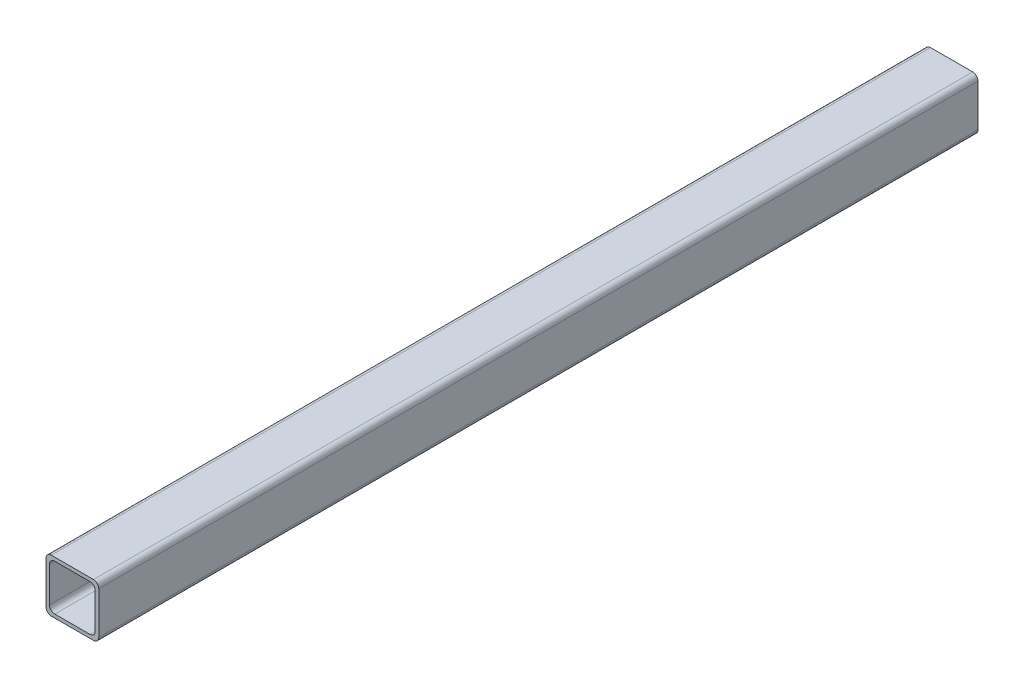
ISO-10303-21;
HEADER;
FILE_DESCRIPTION(('STEP AP214'),'2;1');
FILE_NAME('part.step','',(''),(''),'','','');
FILE_SCHEMA(('AUTOMOTIVE_DESIGN { 1 0 10303 214 1 1 1 1 }'));
ENDSEC;
DATA;
#1=APPLICATION_CONTEXT('core data for automotive mechanical design processes');
#2=APPLICATION_PROTOCOL_DEFINITION('international standard','automotive_design',2000,#1);
#3=PRODUCT_CONTEXT('',#1,'mechanical');
#4=PRODUCT('Part','Part','',(#3));
#5=PRODUCT_RELATED_PRODUCT_CATEGORY('part','',(#4));
#6=PRODUCT_DEFINITION_FORMATION('','',#4);
#7=PRODUCT_DEFINITION_CONTEXT('part definition',#1,'design');
#8=PRODUCT_DEFINITION('design','',#6,#7);
#9=PRODUCT_DEFINITION_SHAPE('','',#8);
#10=(LENGTH_UNIT() NAMED_UNIT(*) SI_UNIT(.MILLI.,.METRE.));
#11=(NAMED_UNIT(*) PLANE_ANGLE_UNIT() SI_UNIT($,.RADIAN.));
#12=(NAMED_UNIT(*) SI_UNIT($,.STERADIAN.) SOLID_ANGLE_UNIT());
#13=UNCERTAINTY_MEASURE_WITH_UNIT(LENGTH_MEASURE(1.E-05),#10,'distance_accuracy_value','');
#14=(GEOMETRIC_REPRESENTATION_CONTEXT(3) GLOBAL_UNCERTAINTY_ASSIGNED_CONTEXT((#13)) GLOBAL_UNIT_ASSIGNED_CONTEXT((#10,
#11,#12)) REPRESENTATION_CONTEXT('',''));
#15=CARTESIAN_POINT('',(0.,0.,0.));
#16=DIRECTION('',(0.,0.,1.));
#17=DIRECTION('',(1.,0.,0.));
#18=AXIS2_PLACEMENT_3D('',#15,#16,#17);
#19=CARTESIAN_POINT('',(12.,-12.,-500.));
#20=DIRECTION('',(0.,0.,1.));
#21=DIRECTION('',(1.,0.,0.));
#22=AXIS2_PLACEMENT_3D('',#19,#20,#21);
#23=CYLINDRICAL_SURFACE('',#22,3.);
#24=CARTESIAN_POINT('',(12.,-12.,0.));
#25=DIRECTION('',(0.,0.,1.));
#26=DIRECTION('',(1.,0.,0.));
#27=AXIS2_PLACEMENT_3D('',#24,#25,#26);
#28=CIRCLE('',#27,3.);
#29=CARTESIAN_POINT('',(12.,-15.,0.));
#30=VERTEX_POINT('',#29);
#31=CARTESIAN_POINT('',(15.,-12.,0.));
#32=VERTEX_POINT('',#31);
#33=EDGE_CURVE('E203',#30,#32,#28,.T.);
#34=ORIENTED_EDGE('',*,*,#33,.F.);
#35=DIRECTION('',(0.,0.,1.));
#36=VECTOR('',#35,1.);
#37=CARTESIAN_POINT('',(12.,-15.,-500.));
#38=LINE('',#37,#36);
#39=CARTESIAN_POINT('',(12.,-15.,-500.));
#40=VERTEX_POINT('',#39);
#41=EDGE_CURVE('E11',#40,#30,#38,.T.);
#42=ORIENTED_EDGE('',*,*,#41,.F.);
#43=CARTESIAN_POINT('',(12.,-12.,-500.));
#44=DIRECTION('',(0.,0.,1.));
#45=DIRECTION('',(1.,0.,0.));
#46=AXIS2_PLACEMENT_3D('',#43,#44,#45);
#47=CIRCLE('',#46,3.);
#48=CARTESIAN_POINT('',(15.,-12.,-500.));
#49=VERTEX_POINT('',#48);
#50=EDGE_CURVE('E215',#40,#49,#47,.T.);
#51=ORIENTED_EDGE('',*,*,#50,.T.);
#52=DIRECTION('',(0.,0.,1.));
#53=VECTOR('',#52,1.);
#54=CARTESIAN_POINT('',(15.,-12.,-500.));
#55=LINE('',#54,#53);
#56=EDGE_CURVE('E36',#49,#32,#55,.T.);
#57=ORIENTED_EDGE('',*,*,#56,.T.);
#58=EDGE_LOOP('',(#34,#42,#51,#57));
#59=FACE_BOUND('',#58,.T.);
#60=ADVANCED_FACE('F33',(#59),#23,.T.);
#61=CARTESIAN_POINT('',(-12.,-15.,-500.));
#62=DIRECTION('',(0.,-1.,0.));
#63=DIRECTION('',(1.,0.,0.));
#64=AXIS2_PLACEMENT_3D('',#61,#62,#63);
#65=PLANE('',#64);
#66=DIRECTION('',(1.,0.,0.));
#67=VECTOR('',#66,1.);
#68=CARTESIAN_POINT('',(-12.,-15.,0.));
#69=LINE('',#68,#67);
#70=CARTESIAN_POINT('',(-12.,-15.,0.));
#71=VERTEX_POINT('',#70);
#72=EDGE_CURVE('E219',#71,#30,#69,.T.);
#73=ORIENTED_EDGE('',*,*,#72,.F.);
#74=DIRECTION('',(0.,0.,1.));
#75=VECTOR('',#74,1.);
#76=CARTESIAN_POINT('',(-12.,-15.,-500.));
#77=LINE('',#76,#75);
#78=CARTESIAN_POINT('',(-12.,-15.,-500.));
#79=VERTEX_POINT('',#78);
#80=EDGE_CURVE('E41',#79,#71,#77,.T.);
#81=ORIENTED_EDGE('',*,*,#80,.F.);
#82=DIRECTION('',(1.,0.,0.));
#83=VECTOR('',#82,1.);
#84=CARTESIAN_POINT('',(-12.,-15.,-500.));
#85=LINE('',#84,#83);
#86=EDGE_CURVE('E237',#79,#40,#85,.T.);
#87=ORIENTED_EDGE('',*,*,#86,.T.);
#88=ORIENTED_EDGE('',*,*,#41,.T.);
#89=EDGE_LOOP('',(#73,#81,#87,#88));
#90=FACE_BOUND('',#89,.T.);
#91=ADVANCED_FACE('F284',(#90),#65,.T.);
#92=CARTESIAN_POINT('',(-12.,-12.,-500.));
#93=DIRECTION('',(0.,0.,1.));
#94=DIRECTION('',(1.,0.,0.));
#95=AXIS2_PLACEMENT_3D('',#92,#93,#94);
#96=CYLINDRICAL_SURFACE('',#95,3.);
#97=CARTESIAN_POINT('',(-12.,-12.,0.));
#98=DIRECTION('',(0.,0.,1.));
#99=DIRECTION('',(-1.,0.,0.));
#100=AXIS2_PLACEMENT_3D('',#97,#98,#99);
#101=CIRCLE('',#100,3.);
#102=CARTESIAN_POINT('',(-15.,-12.,0.));
#103=VERTEX_POINT('',#102);
#104=EDGE_CURVE('E257',#103,#71,#101,.T.);
#105=ORIENTED_EDGE('',*,*,#104,.F.);
#106=DIRECTION('',(0.,0.,1.));
#107=VECTOR('',#106,1.);
#108=CARTESIAN_POINT('',(-15.,-12.,-500.));
#109=LINE('',#108,#107);
#110=CARTESIAN_POINT('',(-15.,-12.,-500.));
#111=VERTEX_POINT('',#110);
#112=EDGE_CURVE('E263',#111,#103,#109,.T.);
#113=ORIENTED_EDGE('',*,*,#112,.F.);
#114=CARTESIAN_POINT('',(-12.,-12.,-500.));
#115=DIRECTION('',(0.,0.,1.));
#116=DIRECTION('',(-1.,0.,0.));
#117=AXIS2_PLACEMENT_3D('',#114,#115,#116);
#118=CIRCLE('',#117,3.);
#119=EDGE_CURVE('E234',#111,#79,#118,.T.);
#120=ORIENTED_EDGE('',*,*,#119,.T.);
#121=ORIENTED_EDGE('',*,*,#80,.T.);
#122=EDGE_LOOP('',(#105,#113,#120,#121));
#123=FACE_BOUND('',#122,.T.);
#124=ADVANCED_FACE('F303',(#123),#96,.T.);
#125=CARTESIAN_POINT('',(-15.,-12.,-500.));
#126=DIRECTION('',(-1.,0.,0.));
#127=DIRECTION('',(0.,-1.,0.));
#128=AXIS2_PLACEMENT_3D('',#125,#126,#127);
#129=PLANE('',#128);
#130=DIRECTION('',(0.,-1.,0.));
#131=VECTOR('',#130,1.);
#132=CARTESIAN_POINT('',(-15.,-12.,0.));
#133=LINE('',#132,#131);
#134=CARTESIAN_POINT('',(-15.,12.,0.));
#135=VERTEX_POINT('',#134);
#136=EDGE_CURVE('E254',#135,#103,#133,.T.);
#137=ORIENTED_EDGE('',*,*,#136,.F.);
#138=DIRECTION('',(0.,0.,1.));
#139=VECTOR('',#138,1.);
#140=CARTESIAN_POINT('',(-15.,12.,-500.));
#141=LINE('',#140,#139);
#142=CARTESIAN_POINT('',(-15.,12.,-500.));
#143=VERTEX_POINT('',#142);
#144=EDGE_CURVE('E265',#143,#135,#141,.T.);
#145=ORIENTED_EDGE('',*,*,#144,.F.);
#146=DIRECTION('',(0.,-1.,0.));
#147=VECTOR('',#146,1.);
#148=CARTESIAN_POINT('',(-15.,-12.,-500.));
#149=LINE('',#148,#147);
#150=EDGE_CURVE('E231',#143,#111,#149,.T.);
#151=ORIENTED_EDGE('',*,*,#150,.T.);
#152=ORIENTED_EDGE('',*,*,#112,.T.);
#153=EDGE_LOOP('',(#137,#145,#151,#152));
#154=FACE_BOUND('',#153,.T.);
#155=ADVANCED_FACE('F301',(#154),#129,.T.);
#156=CARTESIAN_POINT('',(-12.,12.,-500.));
#157=DIRECTION('',(0.,0.,1.));
#158=DIRECTION('',(1.,0.,0.));
#159=AXIS2_PLACEMENT_3D('',#156,#157,#158);
#160=CYLINDRICAL_SURFACE('',#159,3.);
#161=CARTESIAN_POINT('',(-12.,12.,0.));
#162=DIRECTION('',(0.,0.,1.));
#163=DIRECTION('',(-1.,0.,0.));
#164=AXIS2_PLACEMENT_3D('',#161,#162,#163);
#165=CIRCLE('',#164,3.);
#166=CARTESIAN_POINT('',(-12.,15.,0.));
#167=VERTEX_POINT('',#166);
#168=EDGE_CURVE('E251',#167,#135,#165,.T.);
#169=ORIENTED_EDGE('',*,*,#168,.F.);
#170=DIRECTION('',(0.,0.,1.));
#171=VECTOR('',#170,1.);
#172=CARTESIAN_POINT('',(-12.,15.,-500.));
#173=LINE('',#172,#171);
#174=CARTESIAN_POINT('',(-12.,15.,-500.));
#175=VERTEX_POINT('',#174);
#176=EDGE_CURVE('E267',#175,#167,#173,.T.);
#177=ORIENTED_EDGE('',*,*,#176,.F.);
#178=CARTESIAN_POINT('',(-12.,12.,-500.));
#179=DIRECTION('',(0.,0.,1.));
#180=DIRECTION('',(-1.,0.,0.));
#181=AXIS2_PLACEMENT_3D('',#178,#179,#180);
#182=CIRCLE('',#181,3.);
#183=EDGE_CURVE('E228',#175,#143,#182,.T.);
#184=ORIENTED_EDGE('',*,*,#183,.T.);
#185=ORIENTED_EDGE('',*,*,#144,.T.);
#186=EDGE_LOOP('',(#169,#177,#184,#185));
#187=FACE_BOUND('',#186,.T.);
#188=ADVANCED_FACE('F297',(#187),#160,.T.);
#189=CARTESIAN_POINT('',(-12.,15.,-500.));
#190=DIRECTION('',(0.,1.,0.));
#191=DIRECTION('',(-1.,0.,0.));
#192=AXIS2_PLACEMENT_3D('',#189,#190,#191);
#193=PLANE('',#192);
#194=DIRECTION('',(-1.,0.,0.));
#195=VECTOR('',#194,1.);
#196=CARTESIAN_POINT('',(-12.,15.,0.));
#197=LINE('',#196,#195);
#198=CARTESIAN_POINT('',(12.,15.,0.));
#199=VERTEX_POINT('',#198);
#200=EDGE_CURVE('E248',#199,#167,#197,.T.);
#201=ORIENTED_EDGE('',*,*,#200,.F.);
#202=DIRECTION('',(0.,0.,1.));
#203=VECTOR('',#202,1.);
#204=CARTESIAN_POINT('',(12.,15.,-500.));
#205=LINE('',#204,#203);
#206=CARTESIAN_POINT('',(12.,15.,-500.));
#207=VERTEX_POINT('',#206);
#208=EDGE_CURVE('E269',#207,#199,#205,.T.);
#209=ORIENTED_EDGE('',*,*,#208,.F.);
#210=DIRECTION('',(-1.,0.,0.));
#211=VECTOR('',#210,1.);
#212=CARTESIAN_POINT('',(-12.,15.,-500.));
#213=LINE('',#212,#211);
#214=EDGE_CURVE('E225',#207,#175,#213,.T.);
#215=ORIENTED_EDGE('',*,*,#214,.T.);
#216=ORIENTED_EDGE('',*,*,#176,.T.);
#217=EDGE_LOOP('',(#201,#209,#215,#216));
#218=FACE_BOUND('',#217,.T.);
#219=ADVANCED_FACE('F295',(#218),#193,.T.);
#220=CARTESIAN_POINT('',(12.,12.,-500.));
#221=DIRECTION('',(0.,0.,1.));
#222=DIRECTION('',(1.,0.,0.));
#223=AXIS2_PLACEMENT_3D('',#220,#221,#222);
#224=CYLINDRICAL_SURFACE('',#223,3.);
#225=CARTESIAN_POINT('',(12.,12.,0.));
#226=DIRECTION('',(0.,0.,1.));
#227=DIRECTION('',(-1.,0.,0.));
#228=AXIS2_PLACEMENT_3D('',#225,#226,#227);
#229=CIRCLE('',#228,3.);
#230=CARTESIAN_POINT('',(15.,12.,0.));
#231=VERTEX_POINT('',#230);
#232=EDGE_CURVE('E245',#231,#199,#229,.T.);
#233=ORIENTED_EDGE('',*,*,#232,.F.);
#234=DIRECTION('',(0.,0.,1.));
#235=VECTOR('',#234,1.);
#236=CARTESIAN_POINT('',(15.,12.,-500.));
#237=LINE('',#236,#235);
#238=CARTESIAN_POINT('',(15.,12.,-500.));
#239=VERTEX_POINT('',#238);
#240=EDGE_CURVE('E270',#239,#231,#237,.T.);
#241=ORIENTED_EDGE('',*,*,#240,.F.);
#242=CARTESIAN_POINT('',(12.,12.,-500.));
#243=DIRECTION('',(0.,0.,1.));
#244=DIRECTION('',(-1.,0.,0.));
#245=AXIS2_PLACEMENT_3D('',#242,#243,#244);
#246=CIRCLE('',#245,3.);
#247=EDGE_CURVE('E222',#239,#207,#246,.T.);
#248=ORIENTED_EDGE('',*,*,#247,.T.);
#249=ORIENTED_EDGE('',*,*,#208,.T.);
#250=EDGE_LOOP('',(#233,#241,#248,#249));
#251=FACE_BOUND('',#250,.T.);
#252=ADVANCED_FACE('F291',(#251),#224,.T.);
#253=CARTESIAN_POINT('',(15.,-12.,-500.));
#254=DIRECTION('',(1.,0.,0.));
#255=DIRECTION('',(0.,0.,-1.));
#256=AXIS2_PLACEMENT_3D('',#253,#254,#255);
#257=PLANE('',#256);
#258=DIRECTION('',(0.,1.,0.));
#259=VECTOR('',#258,1.);
#260=CARTESIAN_POINT('',(15.,-12.,0.));
#261=LINE('',#260,#259);
#262=EDGE_CURVE('E242',#32,#231,#261,.T.);
#263=ORIENTED_EDGE('',*,*,#262,.F.);
#264=ORIENTED_EDGE('',*,*,#56,.F.);
#265=DIRECTION('',(0.,1.,0.));
#266=VECTOR('',#265,1.);
#267=CARTESIAN_POINT('',(15.,-12.,-500.));
#268=LINE('',#267,#266);
#269=EDGE_CURVE('E218',#49,#239,#268,.T.);
#270=ORIENTED_EDGE('',*,*,#269,.T.);
#271=ORIENTED_EDGE('',*,*,#240,.T.);
#272=EDGE_LOOP('',(#263,#264,#270,#271));
#273=FACE_BOUND('',#272,.T.);
#274=ADVANCED_FACE('F278',(#273),#257,.T.);
#275=CARTESIAN_POINT('',(12.,-12.,-500.));
#276=DIRECTION('',(0.,0.,1.));
#277=DIRECTION('',(1.,0.,0.));
#278=AXIS2_PLACEMENT_3D('',#275,#276,#277);
#279=PLANE('',#278);
#280=DIRECTION('',(1.,0.,0.));
#281=VECTOR('',#280,1.);
#282=CARTESIAN_POINT('',(-9.99999999999998,-13.,-500.));
#283=LINE('',#282,#281);
#284=CARTESIAN_POINT('',(-9.99999999999998,-13.,-500.));
#285=VERTEX_POINT('',#284);
#286=CARTESIAN_POINT('',(9.99999999999998,-13.,-500.));
#287=VERTEX_POINT('',#286);
#288=EDGE_CURVE('E154',#285,#287,#283,.T.);
#289=ORIENTED_EDGE('',*,*,#288,.T.);
#290=CARTESIAN_POINT('',(10.,-10.,-500.));
#291=DIRECTION('',(0.,0.,1.));
#292=DIRECTION('',(1.,0.,0.));
#293=AXIS2_PLACEMENT_3D('',#290,#291,#292);
#294=CIRCLE('',#293,3.);
#295=CARTESIAN_POINT('',(13.,-9.99999999999998,-500.));
#296=VERTEX_POINT('',#295);
#297=EDGE_CURVE('E148',#287,#296,#294,.T.);
#298=ORIENTED_EDGE('',*,*,#297,.T.);
#299=DIRECTION('',(0.,1.,0.));
#300=VECTOR('',#299,1.);
#301=CARTESIAN_POINT('',(13.,-9.99999999999998,-500.));
#302=LINE('',#301,#300);
#303=CARTESIAN_POINT('',(13.,9.99999999999997,-500.));
#304=VERTEX_POINT('',#303);
#305=EDGE_CURVE('E157',#296,#304,#302,.T.);
#306=ORIENTED_EDGE('',*,*,#305,.T.);
#307=CARTESIAN_POINT('',(10.,10.,-500.));
#308=DIRECTION('',(0.,0.,1.));
#309=DIRECTION('',(-1.,0.,0.));
#310=AXIS2_PLACEMENT_3D('',#307,#308,#309);
#311=CIRCLE('',#310,3.);
#312=CARTESIAN_POINT('',(9.99999999999998,13.,-500.));
#313=VERTEX_POINT('',#312);
#314=EDGE_CURVE('E49',#304,#313,#311,.T.);
#315=ORIENTED_EDGE('',*,*,#314,.T.);
#316=DIRECTION('',(-1.,0.,0.));
#317=VECTOR('',#316,1.);
#318=CARTESIAN_POINT('',(-9.99999999999998,13.,-500.));
#319=LINE('',#318,#317);
#320=CARTESIAN_POINT('',(-9.99999999999998,13.,-500.));
#321=VERTEX_POINT('',#320);
#322=EDGE_CURVE('E172',#313,#321,#319,.T.);
#323=ORIENTED_EDGE('',*,*,#322,.T.);
#324=CARTESIAN_POINT('',(-10.,10.,-500.));
#325=DIRECTION('',(0.,0.,1.));
#326=DIRECTION('',(-1.,0.,0.));
#327=AXIS2_PLACEMENT_3D('',#324,#325,#326);
#328=CIRCLE('',#327,3.);
#329=CARTESIAN_POINT('',(-13.,9.99999999999998,-500.));
#330=VERTEX_POINT('',#329);
#331=EDGE_CURVE('E175',#321,#330,#328,.T.);
#332=ORIENTED_EDGE('',*,*,#331,.T.);
#333=DIRECTION('',(0.,-1.,0.));
#334=VECTOR('',#333,1.);
#335=CARTESIAN_POINT('',(-13.,-9.99999999999998,-500.));
#336=LINE('',#335,#334);
#337=CARTESIAN_POINT('',(-13.,-10.,-500.));
#338=VERTEX_POINT('',#337);
#339=EDGE_CURVE('E178',#330,#338,#336,.T.);
#340=ORIENTED_EDGE('',*,*,#339,.T.);
#341=CARTESIAN_POINT('',(-10.,-10.,-500.));
#342=DIRECTION('',(0.,0.,1.));
#343=DIRECTION('',(-1.,0.,0.));
#344=AXIS2_PLACEMENT_3D('',#341,#342,#343);
#345=CIRCLE('',#344,3.);
#346=EDGE_CURVE('E181',#338,#285,#345,.T.);
#347=ORIENTED_EDGE('',*,*,#346,.T.);
#348=EDGE_LOOP('',(#289,#298,#306,#315,#323,#332,#340,#347));
#349=FACE_BOUND('',#348,.T.);
#350=ORIENTED_EDGE('',*,*,#50,.F.);
#351=ORIENTED_EDGE('',*,*,#86,.F.);
#352=ORIENTED_EDGE('',*,*,#119,.F.);
#353=ORIENTED_EDGE('',*,*,#150,.F.);
#354=ORIENTED_EDGE('',*,*,#183,.F.);
#355=ORIENTED_EDGE('',*,*,#214,.F.);
#356=ORIENTED_EDGE('',*,*,#247,.F.);
#357=ORIENTED_EDGE('',*,*,#269,.F.);
#358=EDGE_LOOP('',(#350,#351,#352,#353,#354,#355,#356,#357));
#359=FACE_BOUND('',#358,.T.);
#360=ADVANCED_FACE('F161',(#349,#359),#279,.F.);
#361=CARTESIAN_POINT('',(12.,-12.,0.));
#362=DIRECTION('',(0.,0.,1.));
#363=DIRECTION('',(1.,0.,0.));
#364=AXIS2_PLACEMENT_3D('',#361,#362,#363);
#365=PLANE('',#364);
#366=CARTESIAN_POINT('',(10.,-10.,0.));
#367=DIRECTION('',(0.,0.,1.));
#368=DIRECTION('',(1.,0.,0.));
#369=AXIS2_PLACEMENT_3D('',#366,#367,#368);
#370=CIRCLE('',#369,3.);
#371=CARTESIAN_POINT('',(9.99999999999998,-13.,0.));
#372=VERTEX_POINT('',#371);
#373=CARTESIAN_POINT('',(13.,-9.99999999999998,0.));
#374=VERTEX_POINT('',#373);
#375=EDGE_CURVE('E57',#372,#374,#370,.T.);
#376=ORIENTED_EDGE('',*,*,#375,.F.);
#377=DIRECTION('',(1.,0.,0.));
#378=VECTOR('',#377,1.);
#379=CARTESIAN_POINT('',(-9.99999999999998,-13.,0.));
#380=LINE('',#379,#378);
#381=CARTESIAN_POINT('',(-9.99999999999998,-13.,0.));
#382=VERTEX_POINT('',#381);
#383=EDGE_CURVE('E165',#382,#372,#380,.T.);
#384=ORIENTED_EDGE('',*,*,#383,.F.);
#385=CARTESIAN_POINT('',(-10.,-10.,0.));
#386=DIRECTION('',(0.,0.,1.));
#387=DIRECTION('',(-1.,0.,0.));
#388=AXIS2_PLACEMENT_3D('',#385,#386,#387);
#389=CIRCLE('',#388,3.);
#390=CARTESIAN_POINT('',(-13.,-10.,0.));
#391=VERTEX_POINT('',#390);
#392=EDGE_CURVE('E168',#391,#382,#389,.T.);
#393=ORIENTED_EDGE('',*,*,#392,.F.);
#394=DIRECTION('',(0.,-1.,0.));
#395=VECTOR('',#394,1.);
#396=CARTESIAN_POINT('',(-13.,-9.99999999999998,0.));
#397=LINE('',#396,#395);
#398=CARTESIAN_POINT('',(-13.,9.99999999999998,0.));
#399=VERTEX_POINT('',#398);
#400=EDGE_CURVE('E196',#399,#391,#397,.T.);
#401=ORIENTED_EDGE('',*,*,#400,.F.);
#402=CARTESIAN_POINT('',(-10.,10.,0.));
#403=DIRECTION('',(0.,0.,1.));
#404=DIRECTION('',(-1.,0.,0.));
#405=AXIS2_PLACEMENT_3D('',#402,#403,#404);
#406=CIRCLE('',#405,3.);
#407=CARTESIAN_POINT('',(-9.99999999999998,13.,0.));
#408=VERTEX_POINT('',#407);
#409=EDGE_CURVE('E193',#408,#399,#406,.T.);
#410=ORIENTED_EDGE('',*,*,#409,.F.);
#411=DIRECTION('',(-1.,0.,0.));
#412=VECTOR('',#411,1.);
#413=CARTESIAN_POINT('',(-9.99999999999998,13.,0.));
#414=LINE('',#413,#412);
#415=CARTESIAN_POINT('',(9.99999999999998,13.,0.));
#416=VERTEX_POINT('',#415);
#417=EDGE_CURVE('E190',#416,#408,#414,.T.);
#418=ORIENTED_EDGE('',*,*,#417,.F.);
#419=CARTESIAN_POINT('',(10.,10.,0.));
#420=DIRECTION('',(0.,0.,1.));
#421=DIRECTION('',(-1.,0.,0.));
#422=AXIS2_PLACEMENT_3D('',#419,#420,#421);
#423=CIRCLE('',#422,3.);
#424=CARTESIAN_POINT('',(13.,9.99999999999998,0.));
#425=VERTEX_POINT('',#424);
#426=EDGE_CURVE('E187',#425,#416,#423,.T.);
#427=ORIENTED_EDGE('',*,*,#426,.F.);
#428=DIRECTION('',(0.,1.,0.));
#429=VECTOR('',#428,1.);
#430=CARTESIAN_POINT('',(13.,-9.99999999999998,0.));
#431=LINE('',#430,#429);
#432=EDGE_CURVE('E185',#374,#425,#431,.T.);
#433=ORIENTED_EDGE('',*,*,#432,.F.);
#434=EDGE_LOOP('',(#376,#384,#393,#401,#410,#418,#427,#433));
#435=FACE_BOUND('',#434,.T.);
#436=ORIENTED_EDGE('',*,*,#33,.T.);
#437=ORIENTED_EDGE('',*,*,#262,.T.);
#438=ORIENTED_EDGE('',*,*,#232,.T.);
#439=ORIENTED_EDGE('',*,*,#200,.T.);
#440=ORIENTED_EDGE('',*,*,#168,.T.);
#441=ORIENTED_EDGE('',*,*,#136,.T.);
#442=ORIENTED_EDGE('',*,*,#104,.T.);
#443=ORIENTED_EDGE('',*,*,#72,.T.);
#444=EDGE_LOOP('',(#436,#437,#438,#439,#440,#441,#442,#443));
#445=FACE_BOUND('',#444,.T.);
#446=ADVANCED_FACE('F280',(#435,#445),#365,.T.);
#447=CARTESIAN_POINT('',(10.,-10.,-500.));
#448=DIRECTION('',(0.,0.,1.));
#449=DIRECTION('',(1.,0.,0.));
#450=AXIS2_PLACEMENT_3D('',#447,#448,#449);
#451=CYLINDRICAL_SURFACE('',#450,3.);
#452=ORIENTED_EDGE('',*,*,#375,.T.);
#453=DIRECTION('',(0.,0.,1.));
#454=VECTOR('',#453,1.);
#455=CARTESIAN_POINT('',(13.,-9.99999999999998,-500.));
#456=LINE('',#455,#454);
#457=EDGE_CURVE('E144',#296,#374,#456,.T.);
#458=ORIENTED_EDGE('',*,*,#457,.F.);
#459=ORIENTED_EDGE('',*,*,#297,.F.);
#460=DIRECTION('',(0.,0.,1.));
#461=VECTOR('',#460,1.);
#462=CARTESIAN_POINT('',(9.99999999999998,-13.,-500.));
#463=LINE('',#462,#461);
#464=EDGE_CURVE('E201',#287,#372,#463,.T.);
#465=ORIENTED_EDGE('',*,*,#464,.T.);
#466=EDGE_LOOP('',(#452,#458,#459,#465));
#467=FACE_BOUND('',#466,.T.);
#468=ADVANCED_FACE('F146',(#467),#451,.F.);
#469=CARTESIAN_POINT('',(-9.99999999999998,-13.,-500.));
#470=DIRECTION('',(0.,-1.,0.));
#471=DIRECTION('',(0.,0.,-1.));
#472=AXIS2_PLACEMENT_3D('',#469,#470,#471);
#473=PLANE('',#472);
#474=ORIENTED_EDGE('',*,*,#383,.T.);
#475=ORIENTED_EDGE('',*,*,#464,.F.);
#476=ORIENTED_EDGE('',*,*,#288,.F.);
#477=DIRECTION('',(0.,0.,1.));
#478=VECTOR('',#477,1.);
#479=CARTESIAN_POINT('',(-9.99999999999998,-13.,-500.));
#480=LINE('',#479,#478);
#481=EDGE_CURVE('E204',#285,#382,#480,.T.);
#482=ORIENTED_EDGE('',*,*,#481,.T.);
#483=EDGE_LOOP('',(#474,#475,#476,#482));
#484=FACE_BOUND('',#483,.T.);
#485=ADVANCED_FACE('F386',(#484),#473,.F.);
#486=CARTESIAN_POINT('',(-10.,-10.,-500.));
#487=DIRECTION('',(0.,0.,1.));
#488=DIRECTION('',(1.,0.,0.));
#489=AXIS2_PLACEMENT_3D('',#486,#487,#488);
#490=CYLINDRICAL_SURFACE('',#489,3.);
#491=ORIENTED_EDGE('',*,*,#392,.T.);
#492=ORIENTED_EDGE('',*,*,#481,.F.);
#493=ORIENTED_EDGE('',*,*,#346,.F.);
#494=DIRECTION('',(0.,0.,1.));
#495=VECTOR('',#494,1.);
#496=CARTESIAN_POINT('',(-13.,-10.,-500.));
#497=LINE('',#496,#495);
#498=EDGE_CURVE('E206',#338,#391,#497,.T.);
#499=ORIENTED_EDGE('',*,*,#498,.T.);
#500=EDGE_LOOP('',(#491,#492,#493,#499));
#501=FACE_BOUND('',#500,.T.);
#502=ADVANCED_FACE('F395',(#501),#490,.F.);
#503=CARTESIAN_POINT('',(-13.,-9.99999999999998,-500.));
#504=DIRECTION('',(-1.,0.,0.));
#505=DIRECTION('',(0.,0.,1.));
#506=AXIS2_PLACEMENT_3D('',#503,#504,#505);
#507=PLANE('',#506);
#508=ORIENTED_EDGE('',*,*,#400,.T.);
#509=ORIENTED_EDGE('',*,*,#498,.F.);
#510=ORIENTED_EDGE('',*,*,#339,.F.);
#511=DIRECTION('',(0.,0.,1.));
#512=VECTOR('',#511,1.);
#513=CARTESIAN_POINT('',(-13.,9.99999999999998,-500.));
#514=LINE('',#513,#512);
#515=EDGE_CURVE('E208',#330,#399,#514,.T.);
#516=ORIENTED_EDGE('',*,*,#515,.T.);
#517=EDGE_LOOP('',(#508,#509,#510,#516));
#518=FACE_BOUND('',#517,.T.);
#519=ADVANCED_FACE('F405',(#518),#507,.F.);
#520=CARTESIAN_POINT('',(-10.,10.,-500.));
#521=DIRECTION('',(0.,0.,1.));
#522=DIRECTION('',(1.,0.,0.));
#523=AXIS2_PLACEMENT_3D('',#520,#521,#522);
#524=CYLINDRICAL_SURFACE('',#523,3.);
#525=ORIENTED_EDGE('',*,*,#409,.T.);
#526=ORIENTED_EDGE('',*,*,#515,.F.);
#527=ORIENTED_EDGE('',*,*,#331,.F.);
#528=DIRECTION('',(0.,0.,1.));
#529=VECTOR('',#528,1.);
#530=CARTESIAN_POINT('',(-9.99999999999998,13.,-500.));
#531=LINE('',#530,#529);
#532=EDGE_CURVE('E210',#321,#408,#531,.T.);
#533=ORIENTED_EDGE('',*,*,#532,.T.);
#534=EDGE_LOOP('',(#525,#526,#527,#533));
#535=FACE_BOUND('',#534,.T.);
#536=ADVANCED_FACE('F415',(#535),#524,.F.);
#537=CARTESIAN_POINT('',(-9.99999999999998,13.,-500.));
#538=DIRECTION('',(0.,1.,0.));
#539=DIRECTION('',(0.,0.,1.));
#540=AXIS2_PLACEMENT_3D('',#537,#538,#539);
#541=PLANE('',#540);
#542=ORIENTED_EDGE('',*,*,#417,.T.);
#543=ORIENTED_EDGE('',*,*,#532,.F.);
#544=ORIENTED_EDGE('',*,*,#322,.F.);
#545=DIRECTION('',(0.,0.,1.));
#546=VECTOR('',#545,1.);
#547=CARTESIAN_POINT('',(9.99999999999998,13.,-500.));
#548=LINE('',#547,#546);
#549=EDGE_CURVE('E212',#313,#416,#548,.T.);
#550=ORIENTED_EDGE('',*,*,#549,.T.);
#551=EDGE_LOOP('',(#542,#543,#544,#550));
#552=FACE_BOUND('',#551,.T.);
#553=ADVANCED_FACE('F425',(#552),#541,.F.);
#554=CARTESIAN_POINT('',(10.,10.,-500.));
#555=DIRECTION('',(0.,0.,1.));
#556=DIRECTION('',(1.,0.,0.));
#557=AXIS2_PLACEMENT_3D('',#554,#555,#556);
#558=CYLINDRICAL_SURFACE('',#557,3.);
#559=ORIENTED_EDGE('',*,*,#426,.T.);
#560=ORIENTED_EDGE('',*,*,#549,.F.);
#561=ORIENTED_EDGE('',*,*,#314,.F.);
#562=DIRECTION('',(0.,0.,1.));
#563=VECTOR('',#562,1.);
#564=CARTESIAN_POINT('',(13.,9.99999999999998,-500.));
#565=LINE('',#564,#563);
#566=EDGE_CURVE('E153',#304,#425,#565,.T.);
#567=ORIENTED_EDGE('',*,*,#566,.T.);
#568=EDGE_LOOP('',(#559,#560,#561,#567));
#569=FACE_BOUND('',#568,.T.);
#570=ADVANCED_FACE('F435',(#569),#558,.F.);
#571=CARTESIAN_POINT('',(13.,-9.99999999999998,-500.));
#572=DIRECTION('',(1.,0.,0.));
#573=DIRECTION('',(0.,0.,-1.));
#574=AXIS2_PLACEMENT_3D('',#571,#572,#573);
#575=PLANE('',#574);
#576=ORIENTED_EDGE('',*,*,#432,.T.);
#577=ORIENTED_EDGE('',*,*,#566,.F.);
#578=ORIENTED_EDGE('',*,*,#305,.F.);
#579=ORIENTED_EDGE('',*,*,#457,.T.);
#580=EDGE_LOOP('',(#576,#577,#578,#579));
#581=FACE_BOUND('',#580,.T.);
#582=ADVANCED_FACE('F158',(#581),#575,.F.);
#583=CLOSED_SHELL('',(#60,#91,#124,#155,#188,#219,#252,#274,#360,#446,#468,#485,#502,#519,#536,
#553,#570,#582));
#584=MANIFOLD_SOLID_BREP('B2',#583);
#585=ADVANCED_BREP_SHAPE_REPRESENTATION('',(#18,#584),#14);
#586=SHAPE_DEFINITION_REPRESENTATION(#9,#585);
ENDSEC;
END-ISO-10303-21;
